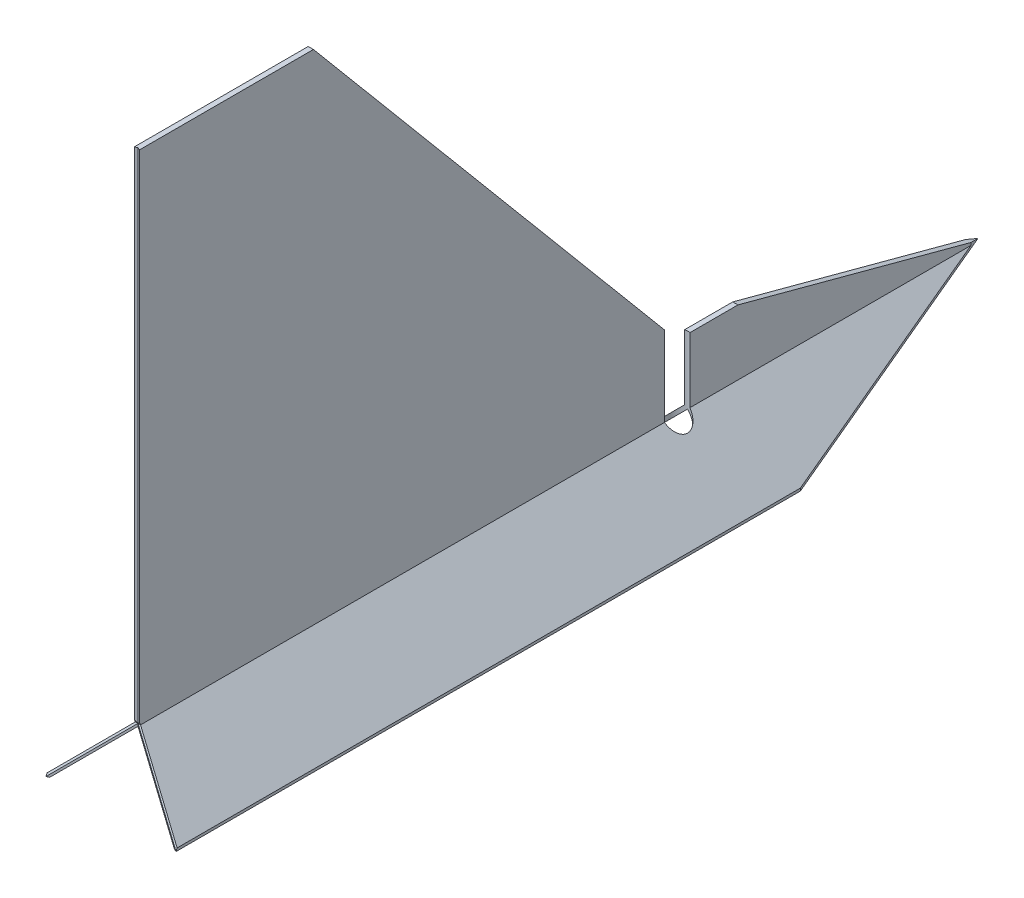
ISO-10303-21;
HEADER;
FILE_DESCRIPTION(('STEP AP214'),'2;1');
FILE_NAME('part.step','',(''),(''),'','','');
FILE_SCHEMA(('AUTOMOTIVE_DESIGN { 1 0 10303 214 1 1 1 1 }'));
ENDSEC;
DATA;
#1=APPLICATION_CONTEXT('core data for automotive mechanical design processes');
#2=APPLICATION_PROTOCOL_DEFINITION('international standard','automotive_design',2000,#1);
#3=PRODUCT_CONTEXT('',#1,'mechanical');
#4=PRODUCT('Part','Part','',(#3));
#5=PRODUCT_RELATED_PRODUCT_CATEGORY('part','',(#4));
#6=PRODUCT_DEFINITION_FORMATION('','',#4);
#7=PRODUCT_DEFINITION_CONTEXT('part definition',#1,'design');
#8=PRODUCT_DEFINITION('design','',#6,#7);
#9=PRODUCT_DEFINITION_SHAPE('','',#8);
#10=(LENGTH_UNIT() NAMED_UNIT(*) SI_UNIT(.MILLI.,.METRE.));
#11=(NAMED_UNIT(*) PLANE_ANGLE_UNIT() SI_UNIT($,.RADIAN.));
#12=(NAMED_UNIT(*) SI_UNIT($,.STERADIAN.) SOLID_ANGLE_UNIT());
#13=UNCERTAINTY_MEASURE_WITH_UNIT(LENGTH_MEASURE(1.E-05),#10,'distance_accuracy_value','');
#14=(GEOMETRIC_REPRESENTATION_CONTEXT(3) GLOBAL_UNCERTAINTY_ASSIGNED_CONTEXT((#13)) GLOBAL_UNIT_ASSIGNED_CONTEXT((#10,
#11,#12)) REPRESENTATION_CONTEXT('',''));
#15=CARTESIAN_POINT('',(0.,0.,0.));
#16=DIRECTION('',(0.,0.,1.));
#17=DIRECTION('',(1.,0.,0.));
#18=AXIS2_PLACEMENT_3D('',#15,#16,#17);
#19=CARTESIAN_POINT('',(408.19364905389,107.5,373.493649053891));
#20=DIRECTION('',(-1.,0.,0.));
#21=DIRECTION('',(0.,0.,1.));
#22=AXIS2_PLACEMENT_3D('',#19,#20,#21);
#23=PLANE('',#22);
#24=DIRECTION('',(0.,0.,1.));
#25=VECTOR('',#24,1.);
#26=CARTESIAN_POINT('',(408.19364905389,50.,373.493649053891));
#27=LINE('',#26,#25);
#28=CARTESIAN_POINT('',(408.19364905389,50.,374.613264296162));
#29=VERTEX_POINT('',#28);
#30=CARTESIAN_POINT('',(408.19364905389,50.,407.023955208221));
#31=VERTEX_POINT('',#30);
#32=EDGE_CURVE('E267',#29,#31,#27,.T.);
#33=ORIENTED_EDGE('',*,*,#32,.T.);
#34=DIRECTION('',(0.,-1.,0.));
#35=VECTOR('',#34,1.);
#36=CARTESIAN_POINT('',(408.19364905389,107.5,407.023955208221));
#37=LINE('',#36,#35);
#38=CARTESIAN_POINT('',(408.19364905389,57.5,407.023955208221));
#39=VERTEX_POINT('',#38);
#40=EDGE_CURVE('E556',#31,#39,#37,.F.);
#41=ORIENTED_EDGE('',*,*,#40,.T.);
#42=DIRECTION('',(0.,0.,1.));
#43=VECTOR('',#42,1.);
#44=CARTESIAN_POINT('',(408.19364905389,57.5,373.493649053891));
#45=LINE('',#44,#43);
#46=CARTESIAN_POINT('',(408.19364905389,57.5,401.484030110658));
#47=VERTEX_POINT('',#46);
#48=EDGE_CURVE('E281',#47,#39,#45,.T.);
#49=ORIENTED_EDGE('',*,*,#48,.F.);
#50=DIRECTION('',(0.,0.258819045102521,0.965925826289068));
#51=VECTOR('',#50,1.);
#52=CARTESIAN_POINT('',(408.19364905389,53.8517696411974,387.868649053891));
#53=LINE('',#52,#51);
#54=CARTESIAN_POINT('',(408.19364905389,50.3,374.613264296162));
#55=VERTEX_POINT('',#54);
#56=EDGE_CURVE('E368',#55,#47,#53,.T.);
#57=ORIENTED_EDGE('',*,*,#56,.F.);
#58=DIRECTION('',(0.,-1.,0.));
#59=VECTOR('',#58,1.);
#60=CARTESIAN_POINT('',(408.19364905389,107.5,374.613264296162));
#61=LINE('',#60,#59);
#62=EDGE_CURVE('E331',#55,#29,#61,.T.);
#63=ORIENTED_EDGE('',*,*,#62,.T.);
#64=EDGE_LOOP('',(#33,#41,#49,#57,#63));
#65=FACE_BOUND('',#64,.T.);
#66=ADVANCED_FACE('F113',(#65),#23,.T.);
#67=DIRECTION('',(0.,0.766044443118982,0.642787609686535));
#68=VECTOR('',#67,1.);
#69=CARTESIAN_POINT('',(408.19364905389,69.6070687639599,418.652685988368));
#70=LINE('',#69,#68);
#71=CARTESIAN_POINT('',(408.19364905389,59.2515129205907,409.963342899561));
#72=VERTEX_POINT('',#71);
#73=CARTESIAN_POINT('',(408.19364905389,107.5,450.448630612755));
#74=VERTEX_POINT('',#73);
#75=EDGE_CURVE('E284',#72,#74,#70,.T.);
#76=ORIENTED_EDGE('',*,*,#75,.F.);
#77=DIRECTION('',(0.,-1.,0.));
#78=VECTOR('',#77,1.);
#79=CARTESIAN_POINT('',(408.19364905389,107.5,409.963342899561));
#80=LINE('',#79,#78);
#81=CARTESIAN_POINT('',(408.19364905389,50.,409.963342899561));
#82=VERTEX_POINT('',#81);
#83=EDGE_CURVE('E428',#72,#82,#80,.T.);
#84=ORIENTED_EDGE('',*,*,#83,.T.);
#85=CARTESIAN_POINT('',(408.19364905389,50.,470.387047336093));
#86=VERTEX_POINT('',#85);
#87=EDGE_CURVE('E271',#82,#86,#27,.T.);
#88=ORIENTED_EDGE('',*,*,#87,.T.);
#89=DIRECTION('',(0.,-0.923879532511285,-0.382683432365094));
#90=VECTOR('',#89,1.);
#91=CARTESIAN_POINT('',(408.19364905389,64.8223304703358,476.526657642882));
#92=LINE('',#91,#90);
#93=CARTESIAN_POINT('',(408.19364905389,50.2999999999999,470.511311404805));
#94=VERTEX_POINT('',#93);
#95=EDGE_CURVE('E340',#94,#86,#92,.T.);
#96=ORIENTED_EDGE('',*,*,#95,.F.);
#97=DIRECTION('',(0.,1.,0.));
#98=VECTOR('',#97,1.);
#99=CARTESIAN_POINT('',(408.19364905389,107.5,470.511311404805));
#100=LINE('',#99,#98);
#101=CARTESIAN_POINT('',(408.19364905389,107.5,470.511311404805));
#102=VERTEX_POINT('',#101);
#103=EDGE_CURVE('E463',#94,#102,#100,.T.);
#104=ORIENTED_EDGE('',*,*,#103,.T.);
#105=DIRECTION('',(0.,0.,1.));
#106=VECTOR('',#105,1.);
#107=CARTESIAN_POINT('',(408.19364905389,107.5,373.493649053891));
#108=LINE('',#107,#106);
#109=EDGE_CURVE('E277',#74,#102,#108,.T.);
#110=ORIENTED_EDGE('',*,*,#109,.F.);
#111=EDGE_LOOP('',(#76,#84,#88,#96,#104,#110));
#112=FACE_BOUND('',#111,.T.);
#113=ADVANCED_FACE('F480',(#112),#23,.T.);
#114=CARTESIAN_POINT('',(408.79364905389,50.,373.493649053891));
#115=DIRECTION('',(1.,0.,0.));
#116=DIRECTION('',(0.,0.,-1.));
#117=AXIS2_PLACEMENT_3D('',#114,#115,#116);
#118=PLANE('',#117);
#119=DIRECTION('',(0.,0.,1.));
#120=VECTOR('',#119,1.);
#121=CARTESIAN_POINT('',(408.79364905389,50.,373.493649053891));
#122=LINE('',#121,#120);
#123=CARTESIAN_POINT('',(408.79364905389,50.,409.963342899561));
#124=VERTEX_POINT('',#123);
#125=CARTESIAN_POINT('',(408.79364905389,50.,470.387047336093));
#126=VERTEX_POINT('',#125);
#127=EDGE_CURVE('E269',#124,#126,#122,.T.);
#128=ORIENTED_EDGE('',*,*,#127,.F.);
#129=DIRECTION('',(0.,-1.,0.));
#130=VECTOR('',#129,1.);
#131=CARTESIAN_POINT('',(408.79364905389,107.5,409.963342899561));
#132=LINE('',#131,#130);
#133=CARTESIAN_POINT('',(408.79364905389,59.2515129205908,409.963342899561));
#134=VERTEX_POINT('',#133);
#135=EDGE_CURVE('E429',#124,#134,#132,.F.);
#136=ORIENTED_EDGE('',*,*,#135,.T.);
#137=DIRECTION('',(0.,-0.766044443118982,-0.642787609686535));
#138=VECTOR('',#137,1.);
#139=CARTESIAN_POINT('',(408.79364905389,35.8646836560354,390.339463089267));
#140=LINE('',#139,#138);
#141=CARTESIAN_POINT('',(408.79364905389,107.5,450.448630612755));
#142=VERTEX_POINT('',#141);
#143=EDGE_CURVE('E280',#142,#134,#140,.T.);
#144=ORIENTED_EDGE('',*,*,#143,.F.);
#145=DIRECTION('',(0.,0.,1.));
#146=VECTOR('',#145,1.);
#147=CARTESIAN_POINT('',(408.79364905389,107.5,373.493649053891));
#148=LINE('',#147,#146);
#149=CARTESIAN_POINT('',(408.79364905389,107.5,470.511311404805));
#150=VERTEX_POINT('',#149);
#151=EDGE_CURVE('E285',#142,#150,#148,.T.);
#152=ORIENTED_EDGE('',*,*,#151,.T.);
#153=DIRECTION('',(0.,-1.,0.));
#154=VECTOR('',#153,1.);
#155=CARTESIAN_POINT('',(408.79364905389,50.,470.511311404805));
#156=LINE('',#155,#154);
#157=CARTESIAN_POINT('',(408.79364905389,50.2999999999999,470.511311404805));
#158=VERTEX_POINT('',#157);
#159=EDGE_CURVE('E401',#150,#158,#156,.T.);
#160=ORIENTED_EDGE('',*,*,#159,.T.);
#161=DIRECTION('',(0.,0.923879532511285,0.382683432365094));
#162=VECTOR('',#161,1.);
#163=CARTESIAN_POINT('',(408.79364905389,15.7430105112227,456.197337683769));
#164=LINE('',#163,#162);
#165=EDGE_CURVE('E350',#126,#158,#164,.T.);
#166=ORIENTED_EDGE('',*,*,#165,.F.);
#167=EDGE_LOOP('',(#128,#136,#144,#152,#160,#166));
#168=FACE_BOUND('',#167,.T.);
#169=ADVANCED_FACE('F400',(#168),#118,.T.);
#170=DIRECTION('',(0.,0.,-1.));
#171=VECTOR('',#170,1.);
#172=CARTESIAN_POINT('',(408.79364905389,57.5,373.493649053891));
#173=LINE('',#172,#171);
#174=CARTESIAN_POINT('',(408.79364905389,57.5,407.023955208221));
#175=VERTEX_POINT('',#174);
#176=CARTESIAN_POINT('',(408.79364905389,57.5,401.484030110658));
#177=VERTEX_POINT('',#176);
#178=EDGE_CURVE('E371',#175,#177,#173,.T.);
#179=ORIENTED_EDGE('',*,*,#178,.F.);
#180=DIRECTION('',(0.,-1.,0.));
#181=VECTOR('',#180,1.);
#182=CARTESIAN_POINT('',(408.79364905389,107.5,407.023955208221));
#183=LINE('',#182,#181);
#184=CARTESIAN_POINT('',(408.79364905389,50.,407.023955208221));
#185=VERTEX_POINT('',#184);
#186=EDGE_CURVE('E128',#175,#185,#183,.T.);
#187=ORIENTED_EDGE('',*,*,#186,.T.);
#188=CARTESIAN_POINT('',(408.79364905389,50.,374.613264296162));
#189=VERTEX_POINT('',#188);
#190=EDGE_CURVE('E274',#189,#185,#122,.T.);
#191=ORIENTED_EDGE('',*,*,#190,.F.);
#192=DIRECTION('',(0.,1.,0.));
#193=VECTOR('',#192,1.);
#194=CARTESIAN_POINT('',(408.79364905389,50.,374.613264296162));
#195=LINE('',#194,#193);
#196=CARTESIAN_POINT('',(408.79364905389,50.3,374.613264296162));
#197=VERTEX_POINT('',#196);
#198=EDGE_CURVE('E325',#189,#197,#195,.T.);
#199=ORIENTED_EDGE('',*,*,#198,.T.);
#200=DIRECTION('',(0.,-0.258819045102521,-0.965925826289068));
#201=VECTOR('',#200,1.);
#202=CARTESIAN_POINT('',(408.79364905389,50.,373.493649053891));
#203=LINE('',#202,#201);
#204=EDGE_CURVE('E324',#177,#197,#203,.T.);
#205=ORIENTED_EDGE('',*,*,#204,.F.);
#206=EDGE_LOOP('',(#179,#187,#191,#199,#205));
#207=FACE_BOUND('',#206,.T.);
#208=ADVANCED_FACE('F517',(#207),#118,.T.);
#209=CARTESIAN_POINT('',(449.452288972116,9.3413600817732,373.493649053891));
#210=DIRECTION('',(0.707106781186551,0.707106781186544,0.));
#211=DIRECTION('',(-0.707106781186544,0.707106781186551,0.));
#212=AXIS2_PLACEMENT_3D('',#209,#210,#211);
#213=PLANE('',#212);
#214=ORIENTED_EDGE('',*,*,#190,.T.);
#215=CARTESIAN_POINT('',(408.49364905389,50.3,408.493649053891));
#216=DIRECTION('',(0.707106781186551,0.707106781186544,0.));
#217=DIRECTION('',(0.707106781186544,-0.707106781186551,0.));
#218=AXIS2_PLACEMENT_3D('',#215,#216,#217);
#219=ELLIPSE('',#218,2.12132034355969,1.50000000000002);
#220=EDGE_CURVE('E387',#185,#124,#219,.F.);
#221=ORIENTED_EDGE('',*,*,#220,.T.);
#222=ORIENTED_EDGE('',*,*,#127,.T.);
#223=DIRECTION('',(-0.678598344545843,0.678598344545849,-0.281084637714825));
#224=VECTOR('',#223,1.);
#225=CARTESIAN_POINT('',(427.758115147957,31.0355339059329,478.242386395421));
#226=LINE('',#225,#224);
#227=CARTESIAN_POINT('',(415.99364905389,42.7999999999999,473.369384985179));
#228=VERTEX_POINT('',#227);
#229=EDGE_CURVE('E356',#228,#126,#226,.T.);
#230=ORIENTED_EDGE('',*,*,#229,.F.);
#231=DIRECTION('',(0.,0.,-1.));
#232=VECTOR('',#231,1.);
#233=CARTESIAN_POINT('',(415.99364905389,42.8,373.493649053891));
#234=LINE('',#233,#232);
#235=CARTESIAN_POINT('',(415.99364905389,42.8,401.484030110659));
#236=VERTEX_POINT('',#235);
#237=EDGE_CURVE('E409',#228,#236,#234,.T.);
#238=ORIENTED_EDGE('',*,*,#237,.T.);
#239=DIRECTION('',(-0.250562807085724,0.250562807085726,-0.935113126531033));
#240=VECTOR('',#239,1.);
#241=CARTESIAN_POINT('',(413.636556803883,45.1570922500069,392.687242075506));
#242=LINE('',#241,#240);
#243=EDGE_CURVE('E328',#236,#189,#242,.T.);
#244=ORIENTED_EDGE('',*,*,#243,.T.);
#245=EDGE_LOOP('',(#214,#221,#222,#230,#238,#244));
#246=FACE_BOUND('',#245,.T.);
#247=ADVANCED_FACE('F385',(#246),#213,.T.);
#248=CARTESIAN_POINT('',(367.535009135664,9.34136008177346,373.493649053891));
#249=DIRECTION('',(-0.707106781186549,0.707106781186546,0.));
#250=DIRECTION('',(-0.707106781186546,-0.707106781186549,0.));
#251=AXIS2_PLACEMENT_3D('',#248,#249,#250);
#252=PLANE('',#251);
#253=ORIENTED_EDGE('',*,*,#87,.F.);
#254=CARTESIAN_POINT('',(408.49364905389,50.3,408.493649053891));
#255=DIRECTION('',(-0.707106781186549,0.707106781186546,0.));
#256=DIRECTION('',(-0.707106781186546,-0.707106781186549,0.));
#257=AXIS2_PLACEMENT_3D('',#254,#255,#256);
#258=ELLIPSE('',#257,2.12132034355968,1.50000000000002);
#259=EDGE_CURVE('E425',#82,#31,#258,.F.);
#260=ORIENTED_EDGE('',*,*,#259,.T.);
#261=ORIENTED_EDGE('',*,*,#32,.F.);
#262=DIRECTION('',(-0.250562807085725,-0.250562807085726,0.935113126531032));
#263=VECTOR('',#262,1.);
#264=CARTESIAN_POINT('',(403.350741303897,45.1570922500069,392.687242075506));
#265=LINE('',#264,#263);
#266=CARTESIAN_POINT('',(400.99364905389,42.8,401.484030110659));
#267=VERTEX_POINT('',#266);
#268=EDGE_CURVE('E326',#29,#267,#265,.T.);
#269=ORIENTED_EDGE('',*,*,#268,.T.);
#270=DIRECTION('',(0.,0.,1.));
#271=VECTOR('',#270,1.);
#272=CARTESIAN_POINT('',(400.99364905389,42.8,373.493649053891));
#273=LINE('',#272,#271);
#274=CARTESIAN_POINT('',(400.99364905389,42.7999999999999,473.369384985179));
#275=VERTEX_POINT('',#274);
#276=EDGE_CURVE('E405',#267,#275,#273,.T.);
#277=ORIENTED_EDGE('',*,*,#276,.T.);
#278=DIRECTION('',(-0.678598344545845,-0.678598344545848,0.281084637714824));
#279=VECTOR('',#278,1.);
#280=CARTESIAN_POINT('',(389.229182959823,31.035533905933,478.24238639542));
#281=LINE('',#280,#279);
#282=EDGE_CURVE('E353',#86,#275,#281,.T.);
#283=ORIENTED_EDGE('',*,*,#282,.F.);
#284=EDGE_LOOP('',(#253,#260,#261,#269,#277,#283));
#285=FACE_BOUND('',#284,.T.);
#286=ADVANCED_FACE('F424',(#285),#252,.T.);
#287=CARTESIAN_POINT('',(408.79364905389,107.5,373.493649053891));
#288=DIRECTION('',(0.,1.,0.));
#289=DIRECTION('',(0.,0.,1.));
#290=AXIS2_PLACEMENT_3D('',#287,#288,#289);
#291=PLANE('',#290);
#292=DIRECTION('',(0.923879532511288,0.,-0.382683432365088));
#293=VECTOR('',#292,1.);
#294=CARTESIAN_POINT('',(400.99364905389,107.5,473.493649053891));
#295=LINE('',#294,#293);
#296=CARTESIAN_POINT('',(408.49364905389,107.5,470.387047336093));
#297=VERTEX_POINT('',#296);
#298=EDGE_CURVE('E437',#102,#297,#295,.T.);
#299=ORIENTED_EDGE('',*,*,#298,.T.);
#300=DIRECTION('',(0.923879532511288,0.,0.382683432365088));
#301=VECTOR('',#300,1.);
#302=CARTESIAN_POINT('',(408.49364905389,107.5,470.387047336093));
#303=LINE('',#302,#301);
#304=EDGE_CURVE('E440',#297,#150,#303,.T.);
#305=ORIENTED_EDGE('',*,*,#304,.T.);
#306=ORIENTED_EDGE('',*,*,#151,.F.);
#307=DIRECTION('',(1.,0.,0.));
#308=VECTOR('',#307,1.);
#309=CARTESIAN_POINT('',(367.535009135664,107.5,450.448630612755));
#310=LINE('',#309,#308);
#311=EDGE_CURVE('E337',#74,#142,#310,.T.);
#312=ORIENTED_EDGE('',*,*,#311,.F.);
#313=ORIENTED_EDGE('',*,*,#109,.T.);
#314=EDGE_LOOP('',(#299,#305,#306,#312,#313));
#315=FACE_BOUND('',#314,.T.);
#316=ADVANCED_FACE('F115',(#315),#291,.T.);
#317=CARTESIAN_POINT('',(367.535009135664,-46.7227771688619,12.5193304105358));
#318=DIRECTION('',(0.,-0.965925826289068,0.258819045102521));
#319=DIRECTION('',(0.,-0.258819045102521,-0.965925826289068));
#320=AXIS2_PLACEMENT_3D('',#317,#318,#319);
#321=PLANE('',#320);
#322=DIRECTION('',(0.250562807085723,0.250562807085732,0.935113126531032));
#323=VECTOR('',#322,1.);
#324=CARTESIAN_POINT('',(315.271840352375,-43.2218087015186,25.5851226063576));
#325=LINE('',#324,#323);
#326=CARTESIAN_POINT('',(408.49364905389,50.,373.493649053891));
#327=VERTEX_POINT('',#326);
#328=EDGE_CURVE('E301',#327,#197,#325,.T.);
#329=ORIENTED_EDGE('',*,*,#328,.F.);
#330=DIRECTION('',(0.250562807085725,-0.250562807085732,-0.935113126531031));
#331=VECTOR('',#330,1.);
#332=CARTESIAN_POINT('',(496.572550005413,-38.0789009515253,44.7787156279722));
#333=LINE('',#332,#331);
#334=EDGE_CURVE('E320',#55,#327,#333,.T.);
#335=ORIENTED_EDGE('',*,*,#334,.F.);
#336=ORIENTED_EDGE('',*,*,#56,.T.);
#337=DIRECTION('',(1.,0.,0.));
#338=VECTOR('',#337,1.);
#339=CARTESIAN_POINT('',(367.535009135664,57.5,401.484030110658));
#340=LINE('',#339,#338);
#341=EDGE_CURVE('E338',#47,#177,#340,.T.);
#342=ORIENTED_EDGE('',*,*,#341,.T.);
#343=ORIENTED_EDGE('',*,*,#204,.T.);
#344=EDGE_LOOP('',(#329,#335,#336,#342,#343));
#345=FACE_BOUND('',#344,.T.);
#346=ADVANCED_FACE('F319',(#345),#321,.F.);
#347=CARTESIAN_POINT('',(367.535009135664,173.629265947172,419.178128674543));
#348=DIRECTION('',(0.,-0.382683432365094,-0.923879532511285));
#349=DIRECTION('',(0.,0.923879532511285,-0.382683432365094));
#350=AXIS2_PLACEMENT_3D('',#347,#348,#349);
#351=PLANE('',#350);
#352=DIRECTION('',(0.,-0.923879532511285,0.382683432365094));
#353=VECTOR('',#352,1.);
#354=CARTESIAN_POINT('',(415.99364905389,173.629265947172,419.178128674543));
#355=LINE('',#354,#353);
#356=CARTESIAN_POINT('',(415.99364905389,42.5,473.493649053891));
#357=VERTEX_POINT('',#356);
#358=EDGE_CURVE('E292',#228,#357,#355,.T.);
#359=ORIENTED_EDGE('',*,*,#358,.F.);
#360=ORIENTED_EDGE('',*,*,#229,.T.);
#361=DIRECTION('',(1.,0.,0.));
#362=VECTOR('',#361,1.);
#363=CARTESIAN_POINT('',(367.535009135664,50.,470.387047336093));
#364=LINE('',#363,#362);
#365=CARTESIAN_POINT('',(408.49364905389,49.9999999999999,470.387047336093));
#366=VERTEX_POINT('',#365);
#367=EDGE_CURVE('E346',#366,#126,#364,.T.);
#368=ORIENTED_EDGE('',*,*,#367,.F.);
#369=DIRECTION('',(-0.678598344545853,0.67859834454584,-0.281084637714821));
#370=VECTOR('',#369,1.);
#371=CARTESIAN_POINT('',(322.93385200229,135.559797051598,434.947019003431));
#372=LINE('',#371,#370);
#373=EDGE_CURVE('E406',#357,#366,#372,.T.);
#374=ORIENTED_EDGE('',*,*,#373,.F.);
#375=EDGE_LOOP('',(#359,#360,#368,#374));
#376=FACE_BOUND('',#375,.T.);
#377=ADVANCED_FACE('F394',(#376),#351,.F.);
#378=DIRECTION('',(-0.678598344545853,-0.67859834454584,0.281084637714821));
#379=VECTOR('',#378,1.);
#380=CARTESIAN_POINT('',(456.330889902129,97.8372408482384,450.572213390244));
#381=LINE('',#380,#379);
#382=CARTESIAN_POINT('',(400.99364905389,42.5,473.493649053891));
#383=VERTEX_POINT('',#382);
#384=EDGE_CURVE('E461',#366,#383,#381,.T.);
#385=ORIENTED_EDGE('',*,*,#384,.F.);
#386=EDGE_CURVE('E343',#86,#366,#364,.T.);
#387=ORIENTED_EDGE('',*,*,#386,.F.);
#388=ORIENTED_EDGE('',*,*,#282,.T.);
#389=DIRECTION('',(0.,0.923879532511285,-0.382683432365094));
#390=VECTOR('',#389,1.);
#391=CARTESIAN_POINT('',(400.99364905389,173.629265947172,419.178128674543));
#392=LINE('',#391,#390);
#393=EDGE_CURVE('E290',#383,#275,#392,.T.);
#394=ORIENTED_EDGE('',*,*,#393,.F.);
#395=EDGE_LOOP('',(#385,#387,#388,#394));
#396=FACE_BOUND('',#395,.T.);
#397=ADVANCED_FACE('F472',(#396),#351,.F.);
#398=CARTESIAN_POINT('',(367.535009135664,-158.984605006499,383.822789615216));
#399=DIRECTION('',(0.,0.382683432365094,-0.923879532511285));
#400=DIRECTION('',(0.,0.923879532511285,0.382683432365094));
#401=AXIS2_PLACEMENT_3D('',#398,#399,#400);
#402=PLANE('',#401);
#403=DIRECTION('',(0.678598344545853,0.67859834454584,0.281084637714821));
#404=VECTOR('',#403,1.);
#405=CARTESIAN_POINT('',(276.884280680254,-81.6093683736334,415.872662020377));
#406=LINE('',#405,#404);
#407=EDGE_CURVE('E399',#366,#158,#406,.T.);
#408=ORIENTED_EDGE('',*,*,#407,.F.);
#409=ORIENTED_EDGE('',*,*,#367,.T.);
#410=ORIENTED_EDGE('',*,*,#165,.T.);
#411=EDGE_LOOP('',(#408,#409,#410));
#412=FACE_BOUND('',#411,.T.);
#413=ADVANCED_FACE('F398',(#412),#402,.F.);
#414=DIRECTION('',(0.678598344545853,-0.67859834454584,-0.281084637714821));
#415=VECTOR('',#414,1.);
#416=CARTESIAN_POINT('',(502.380461224166,-43.886812170274,431.49785640719));
#417=LINE('',#416,#415);
#418=EDGE_CURVE('E454',#94,#366,#417,.T.);
#419=ORIENTED_EDGE('',*,*,#418,.F.);
#420=ORIENTED_EDGE('',*,*,#95,.T.);
#421=ORIENTED_EDGE('',*,*,#386,.T.);
#422=EDGE_LOOP('',(#419,#420,#421));
#423=FACE_BOUND('',#422,.T.);
#424=ADVANCED_FACE('F476',(#423),#402,.F.);
#425=CARTESIAN_POINT('',(367.535009135664,-177.386241430184,211.400690501208));
#426=DIRECTION('',(0.,-0.642787609686535,0.766044443118982));
#427=DIRECTION('',(0.,-0.766044443118982,-0.642787609686535));
#428=AXIS2_PLACEMENT_3D('',#425,#426,#427);
#429=PLANE('',#428);
#430=CARTESIAN_POINT('',(408.49364905389,57.5,408.493649053891));
#431=DIRECTION('',(0.,-0.642787609686535,0.766044443118982));
#432=DIRECTION('',(0.,-0.766044443118982,-0.642787609686535));
#433=AXIS2_PLACEMENT_3D('',#430,#431,#432);
#434=ELLIPSE('',#433,2.33358574029067,1.50000000000002);
#435=EDGE_CURVE('E431',#72,#134,#434,.F.);
#436=ORIENTED_EDGE('',*,*,#435,.F.);
#437=ORIENTED_EDGE('',*,*,#75,.T.);
#438=ORIENTED_EDGE('',*,*,#311,.T.);
#439=ORIENTED_EDGE('',*,*,#143,.T.);
#440=EDGE_LOOP('',(#436,#437,#438,#439));
#441=FACE_BOUND('',#440,.T.);
#442=ADVANCED_FACE('F484',(#441),#429,.F.);
#443=CARTESIAN_POINT('',(367.535009135664,57.4999999999996,0.));
#444=DIRECTION('',(0.,-1.,0.));
#445=DIRECTION('',(0.,0.,-1.));
#446=AXIS2_PLACEMENT_3D('',#443,#444,#445);
#447=PLANE('',#446);
#448=CARTESIAN_POINT('',(408.49364905389,57.5,408.493649053891));
#449=DIRECTION('',(0.,-1.,0.));
#450=DIRECTION('',(0.,0.,-1.));
#451=AXIS2_PLACEMENT_3D('',#448,#449,#450);
#452=CIRCLE('',#451,1.50000000000002);
#453=EDGE_CURVE('E261',#175,#39,#452,.F.);
#454=ORIENTED_EDGE('',*,*,#453,.F.);
#455=ORIENTED_EDGE('',*,*,#178,.T.);
#456=ORIENTED_EDGE('',*,*,#341,.F.);
#457=ORIENTED_EDGE('',*,*,#48,.T.);
#458=EDGE_LOOP('',(#454,#455,#456,#457));
#459=FACE_BOUND('',#458,.T.);
#460=ADVANCED_FACE('F501',(#459),#447,.F.);
#461=CARTESIAN_POINT('',(400.99364905389,42.5,473.493649053891));
#462=DIRECTION('',(0.382683432365088,0.,0.923879532511288));
#463=DIRECTION('',(0.923879532511288,0.,-0.382683432365088));
#464=AXIS2_PLACEMENT_3D('',#461,#462,#463);
#465=PLANE('',#464);
#466=ORIENTED_EDGE('',*,*,#384,.T.);
#467=DIRECTION('',(0.923879532511288,0.,-0.382683432365088));
#468=VECTOR('',#467,1.);
#469=CARTESIAN_POINT('',(400.99364905389,42.5,473.493649053891));
#470=LINE('',#469,#468);
#471=CARTESIAN_POINT('',(401.29364905389,42.5,473.369384985179));
#472=VERTEX_POINT('',#471);
#473=EDGE_CURVE('E445',#383,#472,#470,.T.);
#474=ORIENTED_EDGE('',*,*,#473,.T.);
#475=DIRECTION('',(-0.67859834454585,-0.678598344545845,0.28108463771482));
#476=VECTOR('',#475,1.);
#477=CARTESIAN_POINT('',(426.97544173525,68.1817926813599,462.731638150506));
#478=LINE('',#477,#476);
#479=CARTESIAN_POINT('',(408.49364905389,49.6999999999998,470.387047336093));
#480=VERTEX_POINT('',#479);
#481=EDGE_CURVE('E287',#480,#472,#478,.T.);
#482=ORIENTED_EDGE('',*,*,#481,.F.);
#483=DIRECTION('',(0.,1.,0.));
#484=VECTOR('',#483,1.);
#485=CARTESIAN_POINT('',(408.49364905389,42.5,470.387047336093));
#486=LINE('',#485,#484);
#487=EDGE_CURVE('E455',#480,#366,#486,.T.);
#488=ORIENTED_EDGE('',*,*,#487,.T.);
#489=EDGE_LOOP('',(#466,#474,#482,#488));
#490=FACE_BOUND('',#489,.T.);
#491=ADVANCED_FACE('F491',(#490),#465,.T.);
#492=CARTESIAN_POINT('',(408.49364905389,42.5,470.387047336093));
#493=DIRECTION('',(-0.382683432365088,0.,0.923879532511288));
#494=DIRECTION('',(0.923879532511288,0.,0.382683432365088));
#495=AXIS2_PLACEMENT_3D('',#492,#493,#494);
#496=PLANE('',#495);
#497=ORIENTED_EDGE('',*,*,#373,.T.);
#498=ORIENTED_EDGE('',*,*,#487,.F.);
#499=DIRECTION('',(-0.678598344545846,0.678598344545849,-0.281084637714818));
#500=VECTOR('',#499,1.);
#501=CARTESIAN_POINT('',(427.458115147957,30.7355339059325,478.24238639542));
#502=LINE('',#501,#500);
#503=CARTESIAN_POINT('',(415.69364905389,42.5,473.369384985179));
#504=VERTEX_POINT('',#503);
#505=EDGE_CURVE('E266',#504,#480,#502,.T.);
#506=ORIENTED_EDGE('',*,*,#505,.F.);
#507=DIRECTION('',(0.923879532511288,0.,0.382683432365088));
#508=VECTOR('',#507,1.);
#509=CARTESIAN_POINT('',(408.49364905389,42.5,470.387047336093));
#510=LINE('',#509,#508);
#511=EDGE_CURVE('E447',#504,#357,#510,.T.);
#512=ORIENTED_EDGE('',*,*,#511,.T.);
#513=EDGE_LOOP('',(#497,#498,#506,#512));
#514=FACE_BOUND('',#513,.T.);
#515=ADVANCED_FACE('F489',(#514),#496,.T.);
#516=ORIENTED_EDGE('',*,*,#418,.T.);
#517=EDGE_CURVE('E456',#366,#297,#486,.T.);
#518=ORIENTED_EDGE('',*,*,#517,.T.);
#519=ORIENTED_EDGE('',*,*,#298,.F.);
#520=ORIENTED_EDGE('',*,*,#103,.F.);
#521=EDGE_LOOP('',(#516,#518,#519,#520));
#522=FACE_BOUND('',#521,.T.);
#523=ADVANCED_FACE('F487',(#522),#465,.T.);
#524=ORIENTED_EDGE('',*,*,#304,.F.);
#525=ORIENTED_EDGE('',*,*,#517,.F.);
#526=ORIENTED_EDGE('',*,*,#407,.T.);
#527=ORIENTED_EDGE('',*,*,#159,.F.);
#528=EDGE_LOOP('',(#524,#525,#526,#527));
#529=FACE_BOUND('',#528,.T.);
#530=ADVANCED_FACE('F466',(#529),#496,.T.);
#531=CARTESIAN_POINT('',(400.99364905389,42.5,401.484030110659));
#532=DIRECTION('',(-1.,0.,0.));
#533=DIRECTION('',(0.,0.,1.));
#534=AXIS2_PLACEMENT_3D('',#531,#532,#533);
#535=PLANE('',#534);
#536=DIRECTION('',(0.,1.,0.));
#537=VECTOR('',#536,1.);
#538=CARTESIAN_POINT('',(400.99364905389,42.5,401.484030110659));
#539=LINE('',#538,#537);
#540=CARTESIAN_POINT('',(400.99364905389,42.5,401.484030110659));
#541=VERTEX_POINT('',#540);
#542=EDGE_CURVE('E452',#541,#267,#539,.T.);
#543=ORIENTED_EDGE('',*,*,#542,.F.);
#544=DIRECTION('',(0.,0.,1.));
#545=VECTOR('',#544,1.);
#546=CARTESIAN_POINT('',(400.99364905389,42.5,401.484030110659));
#547=LINE('',#546,#545);
#548=EDGE_CURVE('E442',#541,#383,#547,.T.);
#549=ORIENTED_EDGE('',*,*,#548,.T.);
#550=ORIENTED_EDGE('',*,*,#393,.T.);
#551=ORIENTED_EDGE('',*,*,#276,.F.);
#552=EDGE_LOOP('',(#543,#549,#550,#551));
#553=FACE_BOUND('',#552,.T.);
#554=ADVANCED_FACE('F496',(#553),#535,.T.);
#555=CARTESIAN_POINT('',(408.49364905389,42.5,373.493649053891));
#556=DIRECTION('',(-0.96592582628907,0.,-0.258819045102514));
#557=DIRECTION('',(-0.258819045102514,0.,0.96592582628907));
#558=AXIS2_PLACEMENT_3D('',#555,#556,#557);
#559=PLANE('',#558);
#560=ORIENTED_EDGE('',*,*,#62,.F.);
#561=ORIENTED_EDGE('',*,*,#334,.T.);
#562=DIRECTION('',(-0.250562807085725,-0.250562807085731,0.935113126531031));
#563=VECTOR('',#562,1.);
#564=CARTESIAN_POINT('',(490.294377975945,131.800728922057,68.2091726206051));
#565=LINE('',#564,#563);
#566=EDGE_CURVE('E294',#327,#541,#565,.T.);
#567=ORIENTED_EDGE('',*,*,#566,.T.);
#568=ORIENTED_EDGE('',*,*,#542,.T.);
#569=ORIENTED_EDGE('',*,*,#268,.F.);
#570=EDGE_LOOP('',(#560,#561,#567,#568,#569));
#571=FACE_BOUND('',#570,.T.);
#572=ADVANCED_FACE('F539',(#571),#559,.T.);
#573=CARTESIAN_POINT('',(415.99364905389,42.5,401.484030110659));
#574=DIRECTION('',(0.965925826289071,0.,-0.258819045102512));
#575=DIRECTION('',(-0.258819045102512,0.,-0.965925826289071));
#576=AXIS2_PLACEMENT_3D('',#573,#574,#575);
#577=PLANE('',#576);
#578=DIRECTION('',(0.,1.,0.));
#579=VECTOR('',#578,1.);
#580=CARTESIAN_POINT('',(415.99364905389,42.5,401.484030110659));
#581=LINE('',#580,#579);
#582=CARTESIAN_POINT('',(415.99364905389,42.5,401.484030110659));
#583=VERTEX_POINT('',#582);
#584=EDGE_CURVE('E304',#583,#236,#581,.T.);
#585=ORIENTED_EDGE('',*,*,#584,.F.);
#586=DIRECTION('',(-0.250562807085723,0.250562807085731,-0.935113126531032));
#587=VECTOR('',#586,1.);
#588=CARTESIAN_POINT('',(321.550012381843,136.94363667205,49.0155795989905));
#589=LINE('',#588,#587);
#590=EDGE_CURVE('E121',#583,#327,#589,.T.);
#591=ORIENTED_EDGE('',*,*,#590,.T.);
#592=ORIENTED_EDGE('',*,*,#328,.T.);
#593=ORIENTED_EDGE('',*,*,#198,.F.);
#594=ORIENTED_EDGE('',*,*,#243,.F.);
#595=EDGE_LOOP('',(#585,#591,#592,#593,#594));
#596=FACE_BOUND('',#595,.T.);
#597=ADVANCED_FACE('F299',(#596),#577,.T.);
#598=CARTESIAN_POINT('',(415.99364905389,42.5,473.493649053891));
#599=DIRECTION('',(1.,0.,0.));
#600=DIRECTION('',(0.,0.,-1.));
#601=AXIS2_PLACEMENT_3D('',#598,#599,#600);
#602=PLANE('',#601);
#603=ORIENTED_EDGE('',*,*,#358,.T.);
#604=DIRECTION('',(0.,0.,-1.));
#605=VECTOR('',#604,1.);
#606=CARTESIAN_POINT('',(415.99364905389,42.5,473.493649053891));
#607=LINE('',#606,#605);
#608=EDGE_CURVE('E450',#357,#583,#607,.T.);
#609=ORIENTED_EDGE('',*,*,#608,.T.);
#610=ORIENTED_EDGE('',*,*,#584,.T.);
#611=ORIENTED_EDGE('',*,*,#237,.F.);
#612=EDGE_LOOP('',(#603,#609,#610,#611));
#613=FACE_BOUND('',#612,.T.);
#614=ADVANCED_FACE('F511',(#613),#602,.T.);
#615=CARTESIAN_POINT('',(408.49364905389,49.6999999999999,373.493649053891));
#616=DIRECTION('',(0.707106781186545,-0.70710678118655,0.));
#617=DIRECTION('',(0.70710678118655,0.707106781186545,0.));
#618=AXIS2_PLACEMENT_3D('',#615,#616,#617);
#619=PLANE('',#618);
#620=DIRECTION('',(0.,0.,1.));
#621=VECTOR('',#620,1.);
#622=CARTESIAN_POINT('',(408.49364905389,49.6999999999999,373.493649053891));
#623=LINE('',#622,#621);
#624=CARTESIAN_POINT('',(408.49364905389,49.6999999999998,374.613264296162));
#625=VERTEX_POINT('',#624);
#626=CARTESIAN_POINT('',(408.49364905389,49.6999999999999,406.993649053891));
#627=VERTEX_POINT('',#626);
#628=EDGE_CURVE('E260',#625,#627,#623,.T.);
#629=ORIENTED_EDGE('',*,*,#628,.T.);
#630=CARTESIAN_POINT('',(408.49364905389,49.6999999999998,408.493649053891));
#631=DIRECTION('',(0.707106781186545,-0.70710678118655,0.));
#632=DIRECTION('',(-0.70710678118655,-0.707106781186545,0.));
#633=AXIS2_PLACEMENT_3D('',#630,#631,#632);
#634=ELLIPSE('',#633,2.12132034355967,1.50000000000002);
#635=CARTESIAN_POINT('',(408.49364905389,49.6999999999999,409.993649053891));
#636=VERTEX_POINT('',#635);
#637=EDGE_CURVE('E135',#627,#636,#634,.F.);
#638=ORIENTED_EDGE('',*,*,#637,.T.);
#639=EDGE_CURVE('E257',#636,#480,#623,.T.);
#640=ORIENTED_EDGE('',*,*,#639,.T.);
#641=ORIENTED_EDGE('',*,*,#481,.T.);
#642=DIRECTION('',(0.,0.,1.));
#643=VECTOR('',#642,1.);
#644=CARTESIAN_POINT('',(401.29364905389,42.5,373.493649053891));
#645=LINE('',#644,#643);
#646=CARTESIAN_POINT('',(401.29364905389,42.5,401.484030110658));
#647=VERTEX_POINT('',#646);
#648=EDGE_CURVE('E359',#647,#472,#645,.T.);
#649=ORIENTED_EDGE('',*,*,#648,.F.);
#650=DIRECTION('',(-0.250562807085733,-0.250562807085731,0.935113126531029));
#651=VECTOR('',#650,1.);
#652=CARTESIAN_POINT('',(408.755980021713,49.9623309678232,373.634231795847));
#653=LINE('',#652,#651);
#654=EDGE_CURVE('E364',#625,#647,#653,.T.);
#655=ORIENTED_EDGE('',*,*,#654,.F.);
#656=EDGE_LOOP('',(#629,#638,#640,#641,#649,#655));
#657=FACE_BOUND('',#656,.T.);
#658=ADVANCED_FACE('F255',(#657),#619,.T.);
#659=CARTESIAN_POINT('',(449.152288972116,9.04136008177344,373.493649053891));
#660=DIRECTION('',(-0.707106781186549,-0.707106781186546,0.));
#661=DIRECTION('',(0.707106781186546,-0.707106781186549,0.));
#662=AXIS2_PLACEMENT_3D('',#659,#660,#661);
#663=PLANE('',#662);
#664=ORIENTED_EDGE('',*,*,#639,.F.);
#665=CARTESIAN_POINT('',(408.49364905389,49.7,408.493649053891));
#666=DIRECTION('',(-0.707106781186549,-0.707106781186546,0.));
#667=DIRECTION('',(0.707106781186546,-0.707106781186549,0.));
#668=AXIS2_PLACEMENT_3D('',#665,#666,#667);
#669=ELLIPSE('',#668,2.12132034355968,1.50000000000002);
#670=EDGE_CURVE('E13',#636,#627,#669,.F.);
#671=ORIENTED_EDGE('',*,*,#670,.T.);
#672=ORIENTED_EDGE('',*,*,#628,.F.);
#673=DIRECTION('',(-0.25056280708573,0.250562807085731,-0.93511312653103));
#674=VECTOR('',#673,1.);
#675=CARTESIAN_POINT('',(413.336556803883,44.8570922500067,392.687242075506));
#676=LINE('',#675,#674);
#677=CARTESIAN_POINT('',(415.69364905389,42.5,401.484030110658));
#678=VERTEX_POINT('',#677);
#679=EDGE_CURVE('E366',#678,#625,#676,.T.);
#680=ORIENTED_EDGE('',*,*,#679,.F.);
#681=DIRECTION('',(0.,0.,-1.));
#682=VECTOR('',#681,1.);
#683=CARTESIAN_POINT('',(415.69364905389,42.5,373.493649053891));
#684=LINE('',#683,#682);
#685=EDGE_CURVE('E362',#504,#678,#684,.T.);
#686=ORIENTED_EDGE('',*,*,#685,.F.);
#687=ORIENTED_EDGE('',*,*,#505,.T.);
#688=EDGE_LOOP('',(#664,#671,#672,#680,#686,#687));
#689=FACE_BOUND('',#688,.T.);
#690=ADVANCED_FACE('F264',(#689),#663,.T.);
#691=CARTESIAN_POINT('',(367.535009135664,42.5000000000001,0.));
#692=DIRECTION('',(0.,1.,0.));
#693=DIRECTION('',(0.,0.,1.));
#694=AXIS2_PLACEMENT_3D('',#691,#692,#693);
#695=PLANE('',#694);
#696=ORIENTED_EDGE('',*,*,#473,.F.);
#697=ORIENTED_EDGE('',*,*,#548,.F.);
#698=DIRECTION('',(1.,0.,0.));
#699=VECTOR('',#698,1.);
#700=CARTESIAN_POINT('',(367.535009135664,42.5,401.484030110658));
#701=LINE('',#700,#699);
#702=EDGE_CURVE('E312',#541,#647,#701,.T.);
#703=ORIENTED_EDGE('',*,*,#702,.T.);
#704=ORIENTED_EDGE('',*,*,#648,.T.);
#705=EDGE_LOOP('',(#696,#697,#703,#704));
#706=FACE_BOUND('',#705,.T.);
#707=ADVANCED_FACE('F514',(#706),#695,.F.);
#708=CARTESIAN_POINT('',(367.535009135664,140.024047358084,37.5193304105356));
#709=DIRECTION('',(0.,0.965925826289069,0.25881904510252));
#710=DIRECTION('',(0.,-0.25881904510252,0.965925826289069));
#711=AXIS2_PLACEMENT_3D('',#708,#709,#710);
#712=PLANE('',#711);
#713=ORIENTED_EDGE('',*,*,#590,.F.);
#714=EDGE_CURVE('E341',#678,#583,#701,.T.);
#715=ORIENTED_EDGE('',*,*,#714,.F.);
#716=ORIENTED_EDGE('',*,*,#679,.T.);
#717=ORIENTED_EDGE('',*,*,#654,.T.);
#718=ORIENTED_EDGE('',*,*,#702,.F.);
#719=ORIENTED_EDGE('',*,*,#566,.F.);
#720=EDGE_LOOP('',(#713,#715,#716,#717,#718,#719));
#721=FACE_BOUND('',#720,.T.);
#722=ADVANCED_FACE('F310',(#721),#712,.F.);
#723=ORIENTED_EDGE('',*,*,#608,.F.);
#724=ORIENTED_EDGE('',*,*,#511,.F.);
#725=ORIENTED_EDGE('',*,*,#685,.T.);
#726=ORIENTED_EDGE('',*,*,#714,.T.);
#727=EDGE_LOOP('',(#723,#724,#725,#726));
#728=FACE_BOUND('',#727,.T.);
#729=ADVANCED_FACE('F526',(#728),#695,.F.);
#730=CARTESIAN_POINT('',(408.49364905389,107.5,408.493649053891));
#731=DIRECTION('',(0.,-1.,0.));
#732=DIRECTION('',(0.,0.,-1.));
#733=AXIS2_PLACEMENT_3D('',#730,#731,#732);
#734=CYLINDRICAL_SURFACE('',#733,1.50000000000002);
#735=ORIENTED_EDGE('',*,*,#670,.F.);
#736=ORIENTED_EDGE('',*,*,#637,.F.);
#737=EDGE_LOOP('',(#735,#736));
#738=FACE_BOUND('',#737,.T.);
#739=ORIENTED_EDGE('',*,*,#435,.T.);
#740=ORIENTED_EDGE('',*,*,#135,.F.);
#741=ORIENTED_EDGE('',*,*,#220,.F.);
#742=ORIENTED_EDGE('',*,*,#186,.F.);
#743=ORIENTED_EDGE('',*,*,#453,.T.);
#744=ORIENTED_EDGE('',*,*,#40,.F.);
#745=ORIENTED_EDGE('',*,*,#259,.F.);
#746=ORIENTED_EDGE('',*,*,#83,.F.);
#747=EDGE_LOOP('',(#739,#740,#741,#742,#743,#744,#745,#746));
#748=FACE_BOUND('',#747,.T.);
#749=ADVANCED_FACE('F249',(#738,#748),#734,.F.);
#750=CLOSED_SHELL('',(#66,#113,#169,#208,#247,#286,#316,#346,#377,#397,#413,#424,#442,#460,#491,
#515,#523,#530,#554,#572,#597,#614,#658,#690,#707,#722,#729,#749));
#751=MANIFOLD_SOLID_BREP('B2',#750);
#752=ADVANCED_BREP_SHAPE_REPRESENTATION('',(#18,#751),#14);
#753=SHAPE_DEFINITION_REPRESENTATION(#9,#752);
ENDSEC;
END-ISO-10303-21;
